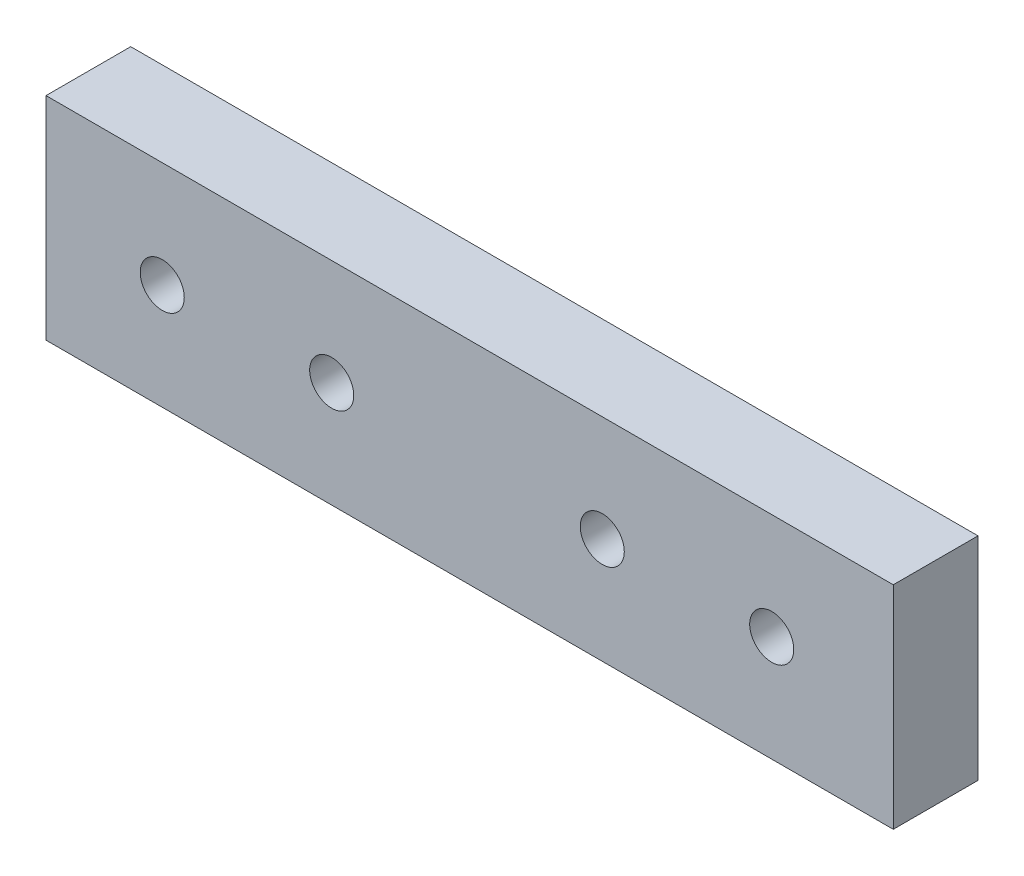
ISO-10303-21;
HEADER;
FILE_DESCRIPTION(('STEP AP214'),'2;1');
FILE_NAME('part.step','',(''),(''),'','','');
FILE_SCHEMA(('AUTOMOTIVE_DESIGN { 1 0 10303 214 1 1 1 1 }'));
ENDSEC;
DATA;
#1=APPLICATION_CONTEXT('core data for automotive mechanical design processes');
#2=APPLICATION_PROTOCOL_DEFINITION('international standard','automotive_design',2000,#1);
#3=PRODUCT_CONTEXT('',#1,'mechanical');
#4=PRODUCT('Part','Part','',(#3));
#5=PRODUCT_RELATED_PRODUCT_CATEGORY('part','',(#4));
#6=PRODUCT_DEFINITION_FORMATION('','',#4);
#7=PRODUCT_DEFINITION_CONTEXT('part definition',#1,'design');
#8=PRODUCT_DEFINITION('design','',#6,#7);
#9=PRODUCT_DEFINITION_SHAPE('','',#8);
#10=(LENGTH_UNIT() NAMED_UNIT(*) SI_UNIT(.MILLI.,.METRE.));
#11=(NAMED_UNIT(*) PLANE_ANGLE_UNIT() SI_UNIT($,.RADIAN.));
#12=(NAMED_UNIT(*) SI_UNIT($,.STERADIAN.) SOLID_ANGLE_UNIT());
#13=UNCERTAINTY_MEASURE_WITH_UNIT(LENGTH_MEASURE(1.E-05),#10,'distance_accuracy_value','');
#14=(GEOMETRIC_REPRESENTATION_CONTEXT(3) GLOBAL_UNCERTAINTY_ASSIGNED_CONTEXT((#13)) GLOBAL_UNIT_ASSIGNED_CONTEXT((#10,
#11,#12)) REPRESENTATION_CONTEXT('',''));
#15=CARTESIAN_POINT('',(0.,0.,0.));
#16=DIRECTION('',(0.,0.,1.));
#17=DIRECTION('',(1.,0.,0.));
#18=AXIS2_PLACEMENT_3D('',#15,#16,#17);
#19=CARTESIAN_POINT('',(-85.3473640143417,12.5,-75.));
#20=DIRECTION('',(0.,0.,1.));
#21=DIRECTION('',(1.,0.,0.));
#22=AXIS2_PLACEMENT_3D('',#19,#20,#21);
#23=CYLINDRICAL_SURFACE('',#22,2.6);
#24=CARTESIAN_POINT('',(-85.3473640143417,12.5,-17.5));
#25=DIRECTION('',(0.,0.,1.));
#26=DIRECTION('',(1.,0.,0.));
#27=AXIS2_PLACEMENT_3D('',#24,#25,#26);
#28=CIRCLE('',#27,2.6);
#29=CARTESIAN_POINT('',(-82.7473640143417,12.5,-17.5));
#30=VERTEX_POINT('',#29);
#31=EDGE_CURVE('E445',#30,#30,#28,.T.);
#32=ORIENTED_EDGE('',*,*,#31,.T.);
#33=EDGE_LOOP('',(#32));
#34=FACE_BOUND('',#33,.T.);
#35=CARTESIAN_POINT('',(-85.3473640143417,12.5,-24.5));
#36=DIRECTION('',(0.,0.,-1.));
#37=DIRECTION('',(-1.,0.,0.));
#38=AXIS2_PLACEMENT_3D('',#35,#36,#37);
#39=CIRCLE('',#38,2.6);
#40=CARTESIAN_POINT('',(-87.9473640143417,12.5,-24.5));
#41=VERTEX_POINT('',#40);
#42=EDGE_CURVE('E37',#41,#41,#39,.F.);
#43=ORIENTED_EDGE('',*,*,#42,.F.);
#44=EDGE_LOOP('',(#43));
#45=FACE_BOUND('',#44,.T.);
#46=ADVANCED_FACE('F33',(#34,#45),#23,.F.);
#47=CARTESIAN_POINT('',(-157.28059455583,12.5,-75.));
#48=DIRECTION('',(0.,0.,1.));
#49=DIRECTION('',(1.,0.,0.));
#50=AXIS2_PLACEMENT_3D('',#47,#48,#49);
#51=CYLINDRICAL_SURFACE('',#50,2.59999999999999);
#52=CARTESIAN_POINT('',(-157.28059455583,12.5,-17.5));
#53=DIRECTION('',(0.,0.,1.));
#54=DIRECTION('',(1.,0.,0.));
#55=AXIS2_PLACEMENT_3D('',#52,#53,#54);
#56=CIRCLE('',#55,2.59999999999999);
#57=CARTESIAN_POINT('',(-154.68059455583,12.5,-17.5));
#58=VERTEX_POINT('',#57);
#59=EDGE_CURVE('E448',#58,#58,#56,.T.);
#60=ORIENTED_EDGE('',*,*,#59,.T.);
#61=EDGE_LOOP('',(#60));
#62=FACE_BOUND('',#61,.T.);
#63=CARTESIAN_POINT('',(-157.28059455583,12.5,-24.5));
#64=DIRECTION('',(0.,0.,-1.));
#65=DIRECTION('',(-1.,0.,0.));
#66=AXIS2_PLACEMENT_3D('',#63,#64,#65);
#67=CIRCLE('',#66,2.59999999999999);
#68=CARTESIAN_POINT('',(-159.88059455583,12.5,-24.5));
#69=VERTEX_POINT('',#68);
#70=EDGE_CURVE('E460',#69,#69,#67,.F.);
#71=ORIENTED_EDGE('',*,*,#70,.F.);
#72=EDGE_LOOP('',(#71));
#73=FACE_BOUND('',#72,.T.);
#74=ADVANCED_FACE('F470',(#62,#73),#51,.F.);
#75=CARTESIAN_POINT('',(-105.347364014342,12.5,-75.));
#76=DIRECTION('',(0.,0.,1.));
#77=DIRECTION('',(1.,0.,0.));
#78=AXIS2_PLACEMENT_3D('',#75,#76,#77);
#79=CYLINDRICAL_SURFACE('',#78,2.6);
#80=CARTESIAN_POINT('',(-105.347364014342,12.5,-17.5));
#81=DIRECTION('',(0.,0.,1.));
#82=DIRECTION('',(1.,0.,0.));
#83=AXIS2_PLACEMENT_3D('',#80,#81,#82);
#84=CIRCLE('',#83,2.6);
#85=CARTESIAN_POINT('',(-102.747364014342,12.5,-17.5));
#86=VERTEX_POINT('',#85);
#87=EDGE_CURVE('E451',#86,#86,#84,.T.);
#88=ORIENTED_EDGE('',*,*,#87,.T.);
#89=EDGE_LOOP('',(#88));
#90=FACE_BOUND('',#89,.T.);
#91=CARTESIAN_POINT('',(-105.347364014342,12.5,-24.5));
#92=DIRECTION('',(0.,0.,-1.));
#93=DIRECTION('',(-1.,0.,0.));
#94=AXIS2_PLACEMENT_3D('',#91,#92,#93);
#95=CIRCLE('',#94,2.6);
#96=CARTESIAN_POINT('',(-107.947364014342,12.5,-24.5));
#97=VERTEX_POINT('',#96);
#98=EDGE_CURVE('E458',#97,#97,#95,.F.);
#99=ORIENTED_EDGE('',*,*,#98,.F.);
#100=EDGE_LOOP('',(#99));
#101=FACE_BOUND('',#100,.T.);
#102=ADVANCED_FACE('F476',(#90,#101),#79,.F.);
#103=CARTESIAN_POINT('',(-137.28059455583,12.5,-75.));
#104=DIRECTION('',(0.,0.,1.));
#105=DIRECTION('',(1.,0.,0.));
#106=AXIS2_PLACEMENT_3D('',#103,#104,#105);
#107=CYLINDRICAL_SURFACE('',#106,2.59999999999999);
#108=CARTESIAN_POINT('',(-137.28059455583,12.5,-17.5));
#109=DIRECTION('',(0.,0.,1.));
#110=DIRECTION('',(1.,0.,0.));
#111=AXIS2_PLACEMENT_3D('',#108,#109,#110);
#112=CIRCLE('',#111,2.59999999999999);
#113=CARTESIAN_POINT('',(-134.68059455583,12.5,-17.5));
#114=VERTEX_POINT('',#113);
#115=EDGE_CURVE('E433',#114,#114,#112,.T.);
#116=ORIENTED_EDGE('',*,*,#115,.T.);
#117=EDGE_LOOP('',(#116));
#118=FACE_BOUND('',#117,.T.);
#119=CARTESIAN_POINT('',(-137.28059455583,12.5,-24.5));
#120=DIRECTION('',(0.,0.,-1.));
#121=DIRECTION('',(-1.,0.,0.));
#122=AXIS2_PLACEMENT_3D('',#119,#120,#121);
#123=CIRCLE('',#122,2.59999999999999);
#124=CARTESIAN_POINT('',(-139.88059455583,12.5,-24.5));
#125=VERTEX_POINT('',#124);
#126=EDGE_CURVE('E269',#125,#125,#123,.F.);
#127=ORIENTED_EDGE('',*,*,#126,.F.);
#128=EDGE_LOOP('',(#127));
#129=FACE_BOUND('',#128,.T.);
#130=ADVANCED_FACE('F502',(#118,#129),#107,.F.);
#131=CARTESIAN_POINT('',(-171.,0.,-27.5));
#132=DIRECTION('',(1.,0.,0.));
#133=DIRECTION('',(0.,0.,-1.));
#134=AXIS2_PLACEMENT_3D('',#131,#132,#133);
#135=PLANE('',#134);
#136=DIRECTION('',(0.,1.,0.));
#137=VECTOR('',#136,1.);
#138=CARTESIAN_POINT('',(-171.,0.,-17.5));
#139=LINE('',#138,#137);
#140=CARTESIAN_POINT('',(-171.,0.,-17.5));
#141=VERTEX_POINT('',#140);
#142=CARTESIAN_POINT('',(-171.,25.,-17.5));
#143=VERTEX_POINT('',#142);
#144=EDGE_CURVE('E429',#141,#143,#139,.T.);
#145=ORIENTED_EDGE('',*,*,#144,.T.);
#146=DIRECTION('',(0.,0.,1.));
#147=VECTOR('',#146,1.);
#148=CARTESIAN_POINT('',(-171.,25.,-27.5));
#149=LINE('',#148,#147);
#150=CARTESIAN_POINT('',(-171.,25.,-27.5));
#151=VERTEX_POINT('',#150);
#152=EDGE_CURVE('E11',#151,#143,#149,.T.);
#153=ORIENTED_EDGE('',*,*,#152,.F.);
#154=DIRECTION('',(0.,1.,0.));
#155=VECTOR('',#154,1.);
#156=CARTESIAN_POINT('',(-171.,0.,-27.5));
#157=LINE('',#156,#155);
#158=CARTESIAN_POINT('',(-171.,0.,-27.5));
#159=VERTEX_POINT('',#158);
#160=EDGE_CURVE('E418',#159,#151,#157,.T.);
#161=ORIENTED_EDGE('',*,*,#160,.F.);
#162=DIRECTION('',(0.,0.,1.));
#163=VECTOR('',#162,1.);
#164=CARTESIAN_POINT('',(-171.,0.,-27.5));
#165=LINE('',#164,#163);
#166=EDGE_CURVE('E428',#159,#141,#165,.T.);
#167=ORIENTED_EDGE('',*,*,#166,.T.);
#168=EDGE_LOOP('',(#145,#153,#161,#167));
#169=FACE_BOUND('',#168,.T.);
#170=ADVANCED_FACE('F35',(#169),#135,.F.);
#171=CARTESIAN_POINT('',(-71.,25.,-27.5));
#172=DIRECTION('',(0.,-1.,0.));
#173=DIRECTION('',(0.,0.,-1.));
#174=AXIS2_PLACEMENT_3D('',#171,#172,#173);
#175=PLANE('',#174);
#176=DIRECTION('',(1.,0.,0.));
#177=VECTOR('',#176,1.);
#178=CARTESIAN_POINT('',(-71.,25.,-17.5));
#179=LINE('',#178,#177);
#180=CARTESIAN_POINT('',(-71.,25.,-17.5));
#181=VERTEX_POINT('',#180);
#182=EDGE_CURVE('E432',#143,#181,#179,.T.);
#183=ORIENTED_EDGE('',*,*,#182,.T.);
#184=DIRECTION('',(0.,0.,1.));
#185=VECTOR('',#184,1.);
#186=CARTESIAN_POINT('',(-71.,25.,-27.5));
#187=LINE('',#186,#185);
#188=CARTESIAN_POINT('',(-71.,25.,-27.5));
#189=VERTEX_POINT('',#188);
#190=EDGE_CURVE('E42',#189,#181,#187,.T.);
#191=ORIENTED_EDGE('',*,*,#190,.F.);
#192=DIRECTION('',(1.,0.,0.));
#193=VECTOR('',#192,1.);
#194=CARTESIAN_POINT('',(-71.,25.,-27.5));
#195=LINE('',#194,#193);
#196=EDGE_CURVE('E421',#151,#189,#195,.T.);
#197=ORIENTED_EDGE('',*,*,#196,.F.);
#198=ORIENTED_EDGE('',*,*,#152,.T.);
#199=EDGE_LOOP('',(#183,#191,#197,#198));
#200=FACE_BOUND('',#199,.T.);
#201=ADVANCED_FACE('F495',(#200),#175,.F.);
#202=CARTESIAN_POINT('',(-71.,0.,-27.5));
#203=DIRECTION('',(-1.,0.,0.));
#204=DIRECTION('',(0.,0.,1.));
#205=AXIS2_PLACEMENT_3D('',#202,#203,#204);
#206=PLANE('',#205);
#207=DIRECTION('',(0.,-1.,0.));
#208=VECTOR('',#207,1.);
#209=CARTESIAN_POINT('',(-71.,0.,-17.5));
#210=LINE('',#209,#208);
#211=CARTESIAN_POINT('',(-71.,0.,-17.5));
#212=VERTEX_POINT('',#211);
#213=EDGE_CURVE('E435',#181,#212,#210,.T.);
#214=ORIENTED_EDGE('',*,*,#213,.T.);
#215=DIRECTION('',(0.,0.,1.));
#216=VECTOR('',#215,1.);
#217=CARTESIAN_POINT('',(-71.,0.,-27.5));
#218=LINE('',#217,#216);
#219=CARTESIAN_POINT('',(-71.,0.,-27.5));
#220=VERTEX_POINT('',#219);
#221=EDGE_CURVE('E440',#220,#212,#218,.T.);
#222=ORIENTED_EDGE('',*,*,#221,.F.);
#223=DIRECTION('',(0.,-1.,0.));
#224=VECTOR('',#223,1.);
#225=CARTESIAN_POINT('',(-71.,0.,-27.5));
#226=LINE('',#225,#224);
#227=EDGE_CURVE('E424',#189,#220,#226,.T.);
#228=ORIENTED_EDGE('',*,*,#227,.F.);
#229=ORIENTED_EDGE('',*,*,#190,.T.);
#230=EDGE_LOOP('',(#214,#222,#228,#229));
#231=FACE_BOUND('',#230,.T.);
#232=ADVANCED_FACE('F492',(#231),#206,.F.);
#233=CARTESIAN_POINT('',(-71.,0.,-27.5));
#234=DIRECTION('',(0.,1.,0.));
#235=DIRECTION('',(-1.,0.,0.));
#236=AXIS2_PLACEMENT_3D('',#233,#234,#235);
#237=PLANE('',#236);
#238=DIRECTION('',(-1.,0.,0.));
#239=VECTOR('',#238,1.);
#240=CARTESIAN_POINT('',(-71.,0.,-17.5));
#241=LINE('',#240,#239);
#242=EDGE_CURVE('E422',#212,#141,#241,.T.);
#243=ORIENTED_EDGE('',*,*,#242,.T.);
#244=ORIENTED_EDGE('',*,*,#166,.F.);
#245=DIRECTION('',(-1.,0.,0.));
#246=VECTOR('',#245,1.);
#247=CARTESIAN_POINT('',(-71.,0.,-27.5));
#248=LINE('',#247,#246);
#249=EDGE_CURVE('E426',#220,#159,#248,.T.);
#250=ORIENTED_EDGE('',*,*,#249,.F.);
#251=ORIENTED_EDGE('',*,*,#221,.T.);
#252=EDGE_LOOP('',(#243,#244,#250,#251));
#253=FACE_BOUND('',#252,.T.);
#254=ADVANCED_FACE('F485',(#253),#237,.F.);
#255=CARTESIAN_POINT('',(0.,0.,-27.5));
#256=DIRECTION('',(0.,0.,1.));
#257=DIRECTION('',(1.,0.,0.));
#258=AXIS2_PLACEMENT_3D('',#255,#256,#257);
#259=PLANE('',#258);
#260=DIRECTION('',(-0.499999999999999,0.866025403784439,0.));
#261=VECTOR('',#260,1.);
#262=CARTESIAN_POINT('',(-139.647730659508,8.4,-27.5));
#263=LINE('',#262,#261);
#264=CARTESIAN_POINT('',(-139.647730659508,8.39999999999999,-27.5));
#265=VERTEX_POINT('',#264);
#266=CARTESIAN_POINT('',(-142.014866763185,12.5,-27.5));
#267=VERTEX_POINT('',#266);
#268=EDGE_CURVE('E256',#265,#267,#263,.T.);
#269=ORIENTED_EDGE('',*,*,#268,.F.);
#270=DIRECTION('',(-1.,0.,0.));
#271=VECTOR('',#270,1.);
#272=CARTESIAN_POINT('',(-134.913458452153,8.4,-27.5));
#273=LINE('',#272,#271);
#274=CARTESIAN_POINT('',(-134.913458452153,8.4,-27.5));
#275=VERTEX_POINT('',#274);
#276=EDGE_CURVE('E50',#275,#265,#273,.T.);
#277=ORIENTED_EDGE('',*,*,#276,.F.);
#278=DIRECTION('',(-0.5,-0.866025403784438,0.));
#279=VECTOR('',#278,1.);
#280=CARTESIAN_POINT('',(-132.546322348475,12.5,-27.5));
#281=LINE('',#280,#279);
#282=CARTESIAN_POINT('',(-132.546322348475,12.5,-27.5));
#283=VERTEX_POINT('',#282);
#284=EDGE_CURVE('E242',#283,#275,#281,.T.);
#285=ORIENTED_EDGE('',*,*,#284,.F.);
#286=DIRECTION('',(0.499999999999994,-0.866025403784442,0.));
#287=VECTOR('',#286,1.);
#288=CARTESIAN_POINT('',(-134.913458452153,16.6,-27.5));
#289=LINE('',#288,#287);
#290=CARTESIAN_POINT('',(-134.913458452153,16.6,-27.5));
#291=VERTEX_POINT('',#290);
#292=EDGE_CURVE('E245',#291,#283,#289,.T.);
#293=ORIENTED_EDGE('',*,*,#292,.F.);
#294=DIRECTION('',(1.,0.,0.));
#295=VECTOR('',#294,1.);
#296=CARTESIAN_POINT('',(-139.647730659508,16.6,-27.5));
#297=LINE('',#296,#295);
#298=CARTESIAN_POINT('',(-139.647730659508,16.6,-27.5));
#299=VERTEX_POINT('',#298);
#300=EDGE_CURVE('E262',#299,#291,#297,.T.);
#301=ORIENTED_EDGE('',*,*,#300,.F.);
#302=DIRECTION('',(0.5,0.866025403784439,0.));
#303=VECTOR('',#302,1.);
#304=CARTESIAN_POINT('',(-142.014866763185,12.5,-27.5));
#305=LINE('',#304,#303);
#306=EDGE_CURVE('E259',#267,#299,#305,.T.);
#307=ORIENTED_EDGE('',*,*,#306,.F.);
#308=EDGE_LOOP('',(#269,#277,#285,#293,#301,#307));
#309=FACE_BOUND('',#308,.T.);
#310=DIRECTION('',(-0.499999999999999,0.866025403784439,0.));
#311=VECTOR('',#310,1.);
#312=CARTESIAN_POINT('',(-107.714500118019,8.40000000000002,-27.5));
#313=LINE('',#312,#311);
#314=CARTESIAN_POINT('',(-107.714500118019,8.40000000000003,-27.5));
#315=VERTEX_POINT('',#314);
#316=CARTESIAN_POINT('',(-110.081636221697,12.5,-27.5));
#317=VERTEX_POINT('',#316);
#318=EDGE_CURVE('E298',#315,#317,#313,.T.);
#319=ORIENTED_EDGE('',*,*,#318,.F.);
#320=DIRECTION('',(-1.,0.,0.));
#321=VECTOR('',#320,1.);
#322=CARTESIAN_POINT('',(-102.980227910664,8.40000000000002,-27.5));
#323=LINE('',#322,#321);
#324=CARTESIAN_POINT('',(-102.980227910664,8.40000000000002,-27.5));
#325=VERTEX_POINT('',#324);
#326=EDGE_CURVE('E58',#325,#315,#323,.T.);
#327=ORIENTED_EDGE('',*,*,#326,.F.);
#328=DIRECTION('',(-0.499999999999999,-0.866025403784439,0.));
#329=VECTOR('',#328,1.);
#330=CARTESIAN_POINT('',(-100.613091806987,12.5,-27.5));
#331=LINE('',#330,#329);
#332=CARTESIAN_POINT('',(-100.613091806987,12.5,-27.5));
#333=VERTEX_POINT('',#332);
#334=EDGE_CURVE('E281',#333,#325,#331,.T.);
#335=ORIENTED_EDGE('',*,*,#334,.F.);
#336=DIRECTION('',(0.5,-0.866025403784439,0.));
#337=VECTOR('',#336,1.);
#338=CARTESIAN_POINT('',(-102.980227910664,16.6,-27.5));
#339=LINE('',#338,#337);
#340=CARTESIAN_POINT('',(-102.980227910664,16.6,-27.5));
#341=VERTEX_POINT('',#340);
#342=EDGE_CURVE('E308',#341,#333,#339,.T.);
#343=ORIENTED_EDGE('',*,*,#342,.F.);
#344=DIRECTION('',(1.,0.,0.));
#345=VECTOR('',#344,1.);
#346=CARTESIAN_POINT('',(-107.714500118019,16.6,-27.5));
#347=LINE('',#346,#345);
#348=CARTESIAN_POINT('',(-107.714500118019,16.6,-27.5));
#349=VERTEX_POINT('',#348);
#350=EDGE_CURVE('E305',#349,#341,#347,.T.);
#351=ORIENTED_EDGE('',*,*,#350,.F.);
#352=DIRECTION('',(0.499999999999998,0.86602540378444,0.));
#353=VECTOR('',#352,1.);
#354=CARTESIAN_POINT('',(-110.081636221697,12.5,-27.5));
#355=LINE('',#354,#353);
#356=EDGE_CURVE('E302',#317,#349,#355,.T.);
#357=ORIENTED_EDGE('',*,*,#356,.F.);
#358=EDGE_LOOP('',(#319,#327,#335,#343,#351,#357));
#359=FACE_BOUND('',#358,.T.);
#360=DIRECTION('',(-0.5,0.866025403784439,0.));
#361=VECTOR('',#360,1.);
#362=CARTESIAN_POINT('',(-159.759099757909,8.20710306317599,-27.5));
#363=LINE('',#362,#361);
#364=CARTESIAN_POINT('',(-159.759099757909,8.20710306317597,-27.5));
#365=VERTEX_POINT('',#364);
#366=CARTESIAN_POINT('',(-162.237604959988,12.5,-27.5));
#367=VERTEX_POINT('',#366);
#368=EDGE_CURVE('E345',#365,#367,#363,.T.);
#369=ORIENTED_EDGE('',*,*,#368,.F.);
#370=DIRECTION('',(-1.,0.,0.));
#371=VECTOR('',#370,1.);
#372=CARTESIAN_POINT('',(-154.802089353752,8.20710306317599,-27.5));
#373=LINE('',#372,#371);
#374=CARTESIAN_POINT('',(-154.802089353752,8.20710306317599,-27.5));
#375=VERTEX_POINT('',#374);
#376=EDGE_CURVE('E343',#375,#365,#373,.T.);
#377=ORIENTED_EDGE('',*,*,#376,.F.);
#378=DIRECTION('',(-0.499999999999997,-0.86602540378444,0.));
#379=VECTOR('',#378,1.);
#380=CARTESIAN_POINT('',(-152.323584151673,12.5,-27.5));
#381=LINE('',#380,#379);
#382=CARTESIAN_POINT('',(-152.323584151673,12.5,-27.5));
#383=VERTEX_POINT('',#382);
#384=EDGE_CURVE('E327',#383,#375,#381,.T.);
#385=ORIENTED_EDGE('',*,*,#384,.F.);
#386=DIRECTION('',(0.5,-0.866025403784439,0.));
#387=VECTOR('',#386,1.);
#388=CARTESIAN_POINT('',(-154.802089353752,16.792896936824,-27.5));
#389=LINE('',#388,#387);
#390=CARTESIAN_POINT('',(-154.802089353752,16.792896936824,-27.5));
#391=VERTEX_POINT('',#390);
#392=EDGE_CURVE('E355',#391,#383,#389,.T.);
#393=ORIENTED_EDGE('',*,*,#392,.F.);
#394=DIRECTION('',(1.,0.,0.));
#395=VECTOR('',#394,1.);
#396=CARTESIAN_POINT('',(-159.759099757909,16.792896936824,-27.5));
#397=LINE('',#396,#395);
#398=CARTESIAN_POINT('',(-159.759099757909,16.792896936824,-27.5));
#399=VERTEX_POINT('',#398);
#400=EDGE_CURVE('E352',#399,#391,#397,.T.);
#401=ORIENTED_EDGE('',*,*,#400,.F.);
#402=DIRECTION('',(0.500000000000001,0.866025403784438,0.));
#403=VECTOR('',#402,1.);
#404=CARTESIAN_POINT('',(-162.237604959988,12.5,-27.5));
#405=LINE('',#404,#403);
#406=EDGE_CURVE('E349',#367,#399,#405,.T.);
#407=ORIENTED_EDGE('',*,*,#406,.F.);
#408=EDGE_LOOP('',(#369,#377,#385,#393,#401,#407));
#409=FACE_BOUND('',#408,.T.);
#410=DIRECTION('',(-0.500000000000003,0.866025403784437,0.));
#411=VECTOR('',#410,1.);
#412=CARTESIAN_POINT('',(-87.7145001180192,8.39999999999996,-27.5));
#413=LINE('',#412,#411);
#414=CARTESIAN_POINT('',(-87.7145001180192,8.39999999999996,-27.5));
#415=VERTEX_POINT('',#414);
#416=CARTESIAN_POINT('',(-90.0816362216967,12.5,-27.5));
#417=VERTEX_POINT('',#416);
#418=EDGE_CURVE('E393',#415,#417,#413,.T.);
#419=ORIENTED_EDGE('',*,*,#418,.F.);
#420=DIRECTION('',(-1.,0.,0.));
#421=VECTOR('',#420,1.);
#422=CARTESIAN_POINT('',(-82.9802279106642,8.39999999999996,-27.5));
#423=LINE('',#422,#421);
#424=CARTESIAN_POINT('',(-82.9802279106642,8.39999999999996,-27.5));
#425=VERTEX_POINT('',#424);
#426=EDGE_CURVE('E391',#425,#415,#423,.T.);
#427=ORIENTED_EDGE('',*,*,#426,.F.);
#428=DIRECTION('',(-0.499999999999999,-0.866025403784439,0.));
#429=VECTOR('',#428,1.);
#430=CARTESIAN_POINT('',(-80.6130918069868,12.5,-27.5));
#431=LINE('',#430,#429);
#432=CARTESIAN_POINT('',(-80.6130918069868,12.5,-27.5));
#433=VERTEX_POINT('',#432);
#434=EDGE_CURVE('E375',#433,#425,#431,.T.);
#435=ORIENTED_EDGE('',*,*,#434,.F.);
#436=DIRECTION('',(0.5,-0.866025403784439,0.));
#437=VECTOR('',#436,1.);
#438=CARTESIAN_POINT('',(-82.9802279106642,16.6,-27.5));
#439=LINE('',#438,#437);
#440=CARTESIAN_POINT('',(-82.9802279106642,16.6,-27.5));
#441=VERTEX_POINT('',#440);
#442=EDGE_CURVE('E402',#441,#433,#439,.T.);
#443=ORIENTED_EDGE('',*,*,#442,.F.);
#444=DIRECTION('',(1.,0.,0.));
#445=VECTOR('',#444,1.);
#446=CARTESIAN_POINT('',(-87.7145001180192,16.6,-27.5));
#447=LINE('',#446,#445);
#448=CARTESIAN_POINT('',(-87.7145001180192,16.6,-27.5));
#449=VERTEX_POINT('',#448);
#450=EDGE_CURVE('E399',#449,#441,#447,.T.);
#451=ORIENTED_EDGE('',*,*,#450,.F.);
#452=DIRECTION('',(0.500000000000001,0.866025403784438,0.));
#453=VECTOR('',#452,1.);
#454=CARTESIAN_POINT('',(-90.0816362216967,12.5,-27.5));
#455=LINE('',#454,#453);
#456=EDGE_CURVE('E396',#417,#449,#455,.T.);
#457=ORIENTED_EDGE('',*,*,#456,.F.);
#458=EDGE_LOOP('',(#419,#427,#435,#443,#451,#457));
#459=FACE_BOUND('',#458,.T.);
#460=ORIENTED_EDGE('',*,*,#160,.T.);
#461=ORIENTED_EDGE('',*,*,#196,.T.);
#462=ORIENTED_EDGE('',*,*,#227,.T.);
#463=ORIENTED_EDGE('',*,*,#249,.T.);
#464=EDGE_LOOP('',(#460,#461,#462,#463));
#465=FACE_BOUND('',#464,.T.);
#466=ADVANCED_FACE('F481',(#309,#359,#409,#459,#465),#259,.F.);
#467=CARTESIAN_POINT('',(0.,0.,-17.5));
#468=DIRECTION('',(0.,0.,1.));
#469=DIRECTION('',(1.,0.,0.));
#470=AXIS2_PLACEMENT_3D('',#467,#468,#469);
#471=PLANE('',#470);
#472=ORIENTED_EDGE('',*,*,#115,.F.);
#473=EDGE_LOOP('',(#472));
#474=FACE_BOUND('',#473,.T.);
#475=ORIENTED_EDGE('',*,*,#87,.F.);
#476=EDGE_LOOP('',(#475));
#477=FACE_BOUND('',#476,.T.);
#478=ORIENTED_EDGE('',*,*,#59,.F.);
#479=EDGE_LOOP('',(#478));
#480=FACE_BOUND('',#479,.T.);
#481=ORIENTED_EDGE('',*,*,#31,.F.);
#482=EDGE_LOOP('',(#481));
#483=FACE_BOUND('',#482,.T.);
#484=ORIENTED_EDGE('',*,*,#144,.F.);
#485=ORIENTED_EDGE('',*,*,#242,.F.);
#486=ORIENTED_EDGE('',*,*,#213,.F.);
#487=ORIENTED_EDGE('',*,*,#182,.F.);
#488=EDGE_LOOP('',(#484,#485,#486,#487));
#489=FACE_BOUND('',#488,.T.);
#490=ADVANCED_FACE('F484',(#474,#477,#480,#483,#489),#471,.T.);
#491=CARTESIAN_POINT('',(0.,0.,-24.5000000000001));
#492=DIRECTION('',(0.,0.,-1.));
#493=DIRECTION('',(-1.,0.,0.));
#494=AXIS2_PLACEMENT_3D('',#491,#492,#493);
#495=PLANE('',#494);
#496=DIRECTION('',(-1.,0.,0.));
#497=VECTOR('',#496,1.);
#498=CARTESIAN_POINT('',(-134.913458452153,8.4,-24.5));
#499=LINE('',#498,#497);
#500=CARTESIAN_POINT('',(-134.913458452153,8.4,-24.5));
#501=VERTEX_POINT('',#500);
#502=CARTESIAN_POINT('',(-139.647730659508,8.4,-24.5));
#503=VERTEX_POINT('',#502);
#504=EDGE_CURVE('E222',#501,#503,#499,.T.);
#505=ORIENTED_EDGE('',*,*,#504,.T.);
#506=DIRECTION('',(-0.499999999999999,0.866025403784439,0.));
#507=VECTOR('',#506,1.);
#508=CARTESIAN_POINT('',(-139.647730659508,8.4,-24.5));
#509=LINE('',#508,#507);
#510=CARTESIAN_POINT('',(-142.014866763185,12.5,-24.5));
#511=VERTEX_POINT('',#510);
#512=EDGE_CURVE('E231',#503,#511,#509,.T.);
#513=ORIENTED_EDGE('',*,*,#512,.T.);
#514=DIRECTION('',(0.5,0.866025403784439,0.));
#515=VECTOR('',#514,1.);
#516=CARTESIAN_POINT('',(-142.014866763185,12.5,-24.5));
#517=LINE('',#516,#515);
#518=CARTESIAN_POINT('',(-139.647730659508,16.6,-24.5));
#519=VERTEX_POINT('',#518);
#520=EDGE_CURVE('E236',#511,#519,#517,.T.);
#521=ORIENTED_EDGE('',*,*,#520,.T.);
#522=DIRECTION('',(1.,0.,0.));
#523=VECTOR('',#522,1.);
#524=CARTESIAN_POINT('',(-139.647730659508,16.6,-24.5));
#525=LINE('',#524,#523);
#526=CARTESIAN_POINT('',(-134.913458452153,16.6,-24.5));
#527=VERTEX_POINT('',#526);
#528=EDGE_CURVE('E249',#519,#527,#525,.T.);
#529=ORIENTED_EDGE('',*,*,#528,.T.);
#530=DIRECTION('',(0.499999999999994,-0.866025403784442,0.));
#531=VECTOR('',#530,1.);
#532=CARTESIAN_POINT('',(-134.913458452153,16.6,-24.5));
#533=LINE('',#532,#531);
#534=CARTESIAN_POINT('',(-132.546322348475,12.5,-24.5));
#535=VERTEX_POINT('',#534);
#536=EDGE_CURVE('E252',#527,#535,#533,.T.);
#537=ORIENTED_EDGE('',*,*,#536,.T.);
#538=DIRECTION('',(-0.5,-0.866025403784438,0.));
#539=VECTOR('',#538,1.);
#540=CARTESIAN_POINT('',(-132.546322348475,12.5,-24.5));
#541=LINE('',#540,#539);
#542=EDGE_CURVE('E228',#535,#501,#541,.T.);
#543=ORIENTED_EDGE('',*,*,#542,.T.);
#544=EDGE_LOOP('',(#505,#513,#521,#529,#537,#543));
#545=FACE_BOUND('',#544,.T.);
#546=ORIENTED_EDGE('',*,*,#126,.T.);
#547=EDGE_LOOP('',(#546));
#548=FACE_BOUND('',#547,.T.);
#549=ADVANCED_FACE('F238',(#545,#548),#495,.T.);
#550=CARTESIAN_POINT('',(-134.913458452153,8.4,-24.5));
#551=DIRECTION('',(0.,-1.,0.));
#552=DIRECTION('',(1.,0.,0.));
#553=AXIS2_PLACEMENT_3D('',#550,#551,#552);
#554=PLANE('',#553);
#555=ORIENTED_EDGE('',*,*,#276,.T.);
#556=DIRECTION('',(0.,0.,-1.));
#557=VECTOR('',#556,1.);
#558=CARTESIAN_POINT('',(-139.647730659508,8.4,-24.5));
#559=LINE('',#558,#557);
#560=EDGE_CURVE('E218',#503,#265,#559,.T.);
#561=ORIENTED_EDGE('',*,*,#560,.F.);
#562=ORIENTED_EDGE('',*,*,#504,.F.);
#563=DIRECTION('',(0.,0.,-1.));
#564=VECTOR('',#563,1.);
#565=CARTESIAN_POINT('',(-134.913458452153,8.4,-24.5));
#566=LINE('',#565,#564);
#567=EDGE_CURVE('E267',#501,#275,#566,.T.);
#568=ORIENTED_EDGE('',*,*,#567,.T.);
#569=EDGE_LOOP('',(#555,#561,#562,#568));
#570=FACE_BOUND('',#569,.T.);
#571=ADVANCED_FACE('F220',(#570),#554,.F.);
#572=CARTESIAN_POINT('',(-132.546322348475,12.5,-24.5));
#573=DIRECTION('',(0.866025403784438,-0.5,0.));
#574=DIRECTION('',(0.5,0.866025403784439,0.));
#575=AXIS2_PLACEMENT_3D('',#572,#573,#574);
#576=PLANE('',#575);
#577=ORIENTED_EDGE('',*,*,#284,.T.);
#578=ORIENTED_EDGE('',*,*,#567,.F.);
#579=ORIENTED_EDGE('',*,*,#542,.F.);
#580=DIRECTION('',(0.,0.,-1.));
#581=VECTOR('',#580,1.);
#582=CARTESIAN_POINT('',(-132.546322348475,12.5,-24.5));
#583=LINE('',#582,#581);
#584=EDGE_CURVE('E270',#535,#283,#583,.T.);
#585=ORIENTED_EDGE('',*,*,#584,.T.);
#586=EDGE_LOOP('',(#577,#578,#579,#585));
#587=FACE_BOUND('',#586,.T.);
#588=ADVANCED_FACE('F611',(#587),#576,.F.);
#589=CARTESIAN_POINT('',(-134.913458452153,16.6,-24.5));
#590=DIRECTION('',(0.866025403784442,0.499999999999994,0.));
#591=DIRECTION('',(-0.499999999999994,0.866025403784442,0.));
#592=AXIS2_PLACEMENT_3D('',#589,#590,#591);
#593=PLANE('',#592);
#594=ORIENTED_EDGE('',*,*,#292,.T.);
#595=ORIENTED_EDGE('',*,*,#584,.F.);
#596=ORIENTED_EDGE('',*,*,#536,.F.);
#597=DIRECTION('',(0.,0.,-1.));
#598=VECTOR('',#597,1.);
#599=CARTESIAN_POINT('',(-134.913458452153,16.6,-24.5));
#600=LINE('',#599,#598);
#601=EDGE_CURVE('E272',#527,#291,#600,.T.);
#602=ORIENTED_EDGE('',*,*,#601,.T.);
#603=EDGE_LOOP('',(#594,#595,#596,#602));
#604=FACE_BOUND('',#603,.T.);
#605=ADVANCED_FACE('F621',(#604),#593,.F.);
#606=CARTESIAN_POINT('',(-139.647730659508,16.6,-24.5));
#607=DIRECTION('',(0.,1.,0.));
#608=DIRECTION('',(0.,0.,1.));
#609=AXIS2_PLACEMENT_3D('',#606,#607,#608);
#610=PLANE('',#609);
#611=ORIENTED_EDGE('',*,*,#300,.T.);
#612=ORIENTED_EDGE('',*,*,#601,.F.);
#613=ORIENTED_EDGE('',*,*,#528,.F.);
#614=DIRECTION('',(0.,0.,-1.));
#615=VECTOR('',#614,1.);
#616=CARTESIAN_POINT('',(-139.647730659508,16.6,-24.5));
#617=LINE('',#616,#615);
#618=EDGE_CURVE('E274',#519,#299,#617,.T.);
#619=ORIENTED_EDGE('',*,*,#618,.T.);
#620=EDGE_LOOP('',(#611,#612,#613,#619));
#621=FACE_BOUND('',#620,.T.);
#622=ADVANCED_FACE('F617',(#621),#610,.F.);
#623=CARTESIAN_POINT('',(-142.014866763185,12.5,-24.5));
#624=DIRECTION('',(-0.866025403784439,0.5,0.));
#625=DIRECTION('',(-0.5,-0.866025403784439,0.));
#626=AXIS2_PLACEMENT_3D('',#623,#624,#625);
#627=PLANE('',#626);
#628=ORIENTED_EDGE('',*,*,#306,.T.);
#629=ORIENTED_EDGE('',*,*,#618,.F.);
#630=ORIENTED_EDGE('',*,*,#520,.F.);
#631=DIRECTION('',(0.,0.,-1.));
#632=VECTOR('',#631,1.);
#633=CARTESIAN_POINT('',(-142.014866763185,12.5,-24.5));
#634=LINE('',#633,#632);
#635=EDGE_CURVE('E227',#511,#267,#634,.T.);
#636=ORIENTED_EDGE('',*,*,#635,.T.);
#637=EDGE_LOOP('',(#628,#629,#630,#636));
#638=FACE_BOUND('',#637,.T.);
#639=ADVANCED_FACE('F614',(#638),#627,.F.);
#640=CARTESIAN_POINT('',(-139.647730659508,8.4,-24.5));
#641=DIRECTION('',(-0.866025403784439,-0.499999999999999,0.));
#642=DIRECTION('',(0.499999999999999,-0.866025403784439,0.));
#643=AXIS2_PLACEMENT_3D('',#640,#641,#642);
#644=PLANE('',#643);
#645=ORIENTED_EDGE('',*,*,#268,.T.);
#646=ORIENTED_EDGE('',*,*,#635,.F.);
#647=ORIENTED_EDGE('',*,*,#512,.F.);
#648=ORIENTED_EDGE('',*,*,#560,.T.);
#649=EDGE_LOOP('',(#645,#646,#647,#648));
#650=FACE_BOUND('',#649,.T.);
#651=ADVANCED_FACE('F232',(#650),#644,.F.);
#652=CARTESIAN_POINT('',(0.,0.,-24.5000000000001));
#653=DIRECTION('',(0.,0.,-1.));
#654=DIRECTION('',(-1.,0.,0.));
#655=AXIS2_PLACEMENT_3D('',#652,#653,#654);
#656=PLANE('',#655);
#657=DIRECTION('',(-1.,0.,0.));
#658=VECTOR('',#657,1.);
#659=CARTESIAN_POINT('',(-102.980227910664,8.40000000000002,-24.5));
#660=LINE('',#659,#658);
#661=CARTESIAN_POINT('',(-102.980227910664,8.40000000000002,-24.5));
#662=VERTEX_POINT('',#661);
#663=CARTESIAN_POINT('',(-107.714500118019,8.40000000000002,-24.5));
#664=VERTEX_POINT('',#663);
#665=EDGE_CURVE('E277',#662,#664,#660,.T.);
#666=ORIENTED_EDGE('',*,*,#665,.T.);
#667=DIRECTION('',(-0.499999999999999,0.866025403784439,0.));
#668=VECTOR('',#667,1.);
#669=CARTESIAN_POINT('',(-107.714500118019,8.40000000000002,-24.5));
#670=LINE('',#669,#668);
#671=CARTESIAN_POINT('',(-110.081636221697,12.5,-24.5));
#672=VERTEX_POINT('',#671);
#673=EDGE_CURVE('E280',#664,#672,#670,.T.);
#674=ORIENTED_EDGE('',*,*,#673,.T.);
#675=DIRECTION('',(0.499999999999998,0.86602540378444,0.));
#676=VECTOR('',#675,1.);
#677=CARTESIAN_POINT('',(-110.081636221697,12.5,-24.5));
#678=LINE('',#677,#676);
#679=CARTESIAN_POINT('',(-107.714500118019,16.6,-24.5));
#680=VERTEX_POINT('',#679);
#681=EDGE_CURVE('E284',#672,#680,#678,.T.);
#682=ORIENTED_EDGE('',*,*,#681,.T.);
#683=DIRECTION('',(1.,0.,0.));
#684=VECTOR('',#683,1.);
#685=CARTESIAN_POINT('',(-107.714500118019,16.6,-24.5));
#686=LINE('',#685,#684);
#687=CARTESIAN_POINT('',(-102.980227910664,16.6,-24.5));
#688=VERTEX_POINT('',#687);
#689=EDGE_CURVE('E287',#680,#688,#686,.T.);
#690=ORIENTED_EDGE('',*,*,#689,.T.);
#691=DIRECTION('',(0.5,-0.866025403784439,0.));
#692=VECTOR('',#691,1.);
#693=CARTESIAN_POINT('',(-102.980227910664,16.6,-24.5));
#694=LINE('',#693,#692);
#695=CARTESIAN_POINT('',(-100.613091806987,12.5,-24.5));
#696=VERTEX_POINT('',#695);
#697=EDGE_CURVE('E290',#688,#696,#694,.T.);
#698=ORIENTED_EDGE('',*,*,#697,.T.);
#699=DIRECTION('',(-0.499999999999999,-0.866025403784439,0.));
#700=VECTOR('',#699,1.);
#701=CARTESIAN_POINT('',(-100.613091806987,12.5,-24.5));
#702=LINE('',#701,#700);
#703=EDGE_CURVE('E293',#696,#662,#702,.T.);
#704=ORIENTED_EDGE('',*,*,#703,.T.);
#705=EDGE_LOOP('',(#666,#674,#682,#690,#698,#704));
#706=FACE_BOUND('',#705,.T.);
#707=ORIENTED_EDGE('',*,*,#98,.T.);
#708=EDGE_LOOP('',(#707));
#709=FACE_BOUND('',#708,.T.);
#710=ADVANCED_FACE('F587',(#706,#709),#656,.T.);
#711=CARTESIAN_POINT('',(-102.980227910664,8.40000000000002,-24.5));
#712=DIRECTION('',(0.,-1.,0.));
#713=DIRECTION('',(0.,0.,-1.));
#714=AXIS2_PLACEMENT_3D('',#711,#712,#713);
#715=PLANE('',#714);
#716=ORIENTED_EDGE('',*,*,#326,.T.);
#717=DIRECTION('',(0.,0.,-1.));
#718=VECTOR('',#717,1.);
#719=CARTESIAN_POINT('',(-107.714500118019,8.40000000000002,-24.5));
#720=LINE('',#719,#718);
#721=EDGE_CURVE('E296',#664,#315,#720,.T.);
#722=ORIENTED_EDGE('',*,*,#721,.F.);
#723=ORIENTED_EDGE('',*,*,#665,.F.);
#724=DIRECTION('',(0.,0.,-1.));
#725=VECTOR('',#724,1.);
#726=CARTESIAN_POINT('',(-102.980227910664,8.40000000000002,-24.5));
#727=LINE('',#726,#725);
#728=EDGE_CURVE('E257',#662,#325,#727,.T.);
#729=ORIENTED_EDGE('',*,*,#728,.T.);
#730=EDGE_LOOP('',(#716,#722,#723,#729));
#731=FACE_BOUND('',#730,.T.);
#732=ADVANCED_FACE('F583',(#731),#715,.F.);
#733=CARTESIAN_POINT('',(-100.613091806987,12.5,-24.5));
#734=DIRECTION('',(0.866025403784439,-0.499999999999999,0.));
#735=DIRECTION('',(0.499999999999999,0.866025403784439,0.));
#736=AXIS2_PLACEMENT_3D('',#733,#734,#735);
#737=PLANE('',#736);
#738=ORIENTED_EDGE('',*,*,#334,.T.);
#739=ORIENTED_EDGE('',*,*,#728,.F.);
#740=ORIENTED_EDGE('',*,*,#703,.F.);
#741=DIRECTION('',(0.,0.,-1.));
#742=VECTOR('',#741,1.);
#743=CARTESIAN_POINT('',(-100.613091806987,12.5,-24.5));
#744=LINE('',#743,#742);
#745=EDGE_CURVE('E314',#696,#333,#744,.T.);
#746=ORIENTED_EDGE('',*,*,#745,.T.);
#747=EDGE_LOOP('',(#738,#739,#740,#746));
#748=FACE_BOUND('',#747,.T.);
#749=ADVANCED_FACE('F586',(#748),#737,.F.);
#750=CARTESIAN_POINT('',(-102.980227910664,16.6,-24.5));
#751=DIRECTION('',(0.866025403784438,0.5,0.));
#752=DIRECTION('',(-0.5,0.866025403784439,0.));
#753=AXIS2_PLACEMENT_3D('',#750,#751,#752);
#754=PLANE('',#753);
#755=ORIENTED_EDGE('',*,*,#342,.T.);
#756=ORIENTED_EDGE('',*,*,#745,.F.);
#757=ORIENTED_EDGE('',*,*,#697,.F.);
#758=DIRECTION('',(0.,0.,-1.));
#759=VECTOR('',#758,1.);
#760=CARTESIAN_POINT('',(-102.980227910664,16.6,-24.5));
#761=LINE('',#760,#759);
#762=EDGE_CURVE('E316',#688,#341,#761,.T.);
#763=ORIENTED_EDGE('',*,*,#762,.T.);
#764=EDGE_LOOP('',(#755,#756,#757,#763));
#765=FACE_BOUND('',#764,.T.);
#766=ADVANCED_FACE('F598',(#765),#754,.F.);
#767=CARTESIAN_POINT('',(-107.714500118019,16.6,-24.5));
#768=DIRECTION('',(0.,1.,0.));
#769=DIRECTION('',(0.,0.,1.));
#770=AXIS2_PLACEMENT_3D('',#767,#768,#769);
#771=PLANE('',#770);
#772=ORIENTED_EDGE('',*,*,#350,.T.);
#773=ORIENTED_EDGE('',*,*,#762,.F.);
#774=ORIENTED_EDGE('',*,*,#689,.F.);
#775=DIRECTION('',(0.,0.,-1.));
#776=VECTOR('',#775,1.);
#777=CARTESIAN_POINT('',(-107.714500118019,16.6,-24.5));
#778=LINE('',#777,#776);
#779=EDGE_CURVE('E318',#680,#349,#778,.T.);
#780=ORIENTED_EDGE('',*,*,#779,.T.);
#781=EDGE_LOOP('',(#772,#773,#774,#780));
#782=FACE_BOUND('',#781,.T.);
#783=ADVANCED_FACE('F594',(#782),#771,.F.);
#784=CARTESIAN_POINT('',(-110.081636221697,12.5,-24.5));
#785=DIRECTION('',(-0.86602540378444,0.499999999999998,0.));
#786=DIRECTION('',(-0.499999999999998,-0.86602540378444,0.));
#787=AXIS2_PLACEMENT_3D('',#784,#785,#786);
#788=PLANE('',#787);
#789=ORIENTED_EDGE('',*,*,#356,.T.);
#790=ORIENTED_EDGE('',*,*,#779,.F.);
#791=ORIENTED_EDGE('',*,*,#681,.F.);
#792=DIRECTION('',(0.,0.,-1.));
#793=VECTOR('',#792,1.);
#794=CARTESIAN_POINT('',(-110.081636221697,12.5,-24.5));
#795=LINE('',#794,#793);
#796=EDGE_CURVE('E320',#672,#317,#795,.T.);
#797=ORIENTED_EDGE('',*,*,#796,.T.);
#798=EDGE_LOOP('',(#789,#790,#791,#797));
#799=FACE_BOUND('',#798,.T.);
#800=ADVANCED_FACE('F590',(#799),#788,.F.);
#801=CARTESIAN_POINT('',(-107.714500118019,8.40000000000002,-24.5));
#802=DIRECTION('',(-0.866025403784439,-0.499999999999999,0.));
#803=DIRECTION('',(0.499999999999999,-0.866025403784439,0.));
#804=AXIS2_PLACEMENT_3D('',#801,#802,#803);
#805=PLANE('',#804);
#806=ORIENTED_EDGE('',*,*,#318,.T.);
#807=ORIENTED_EDGE('',*,*,#796,.F.);
#808=ORIENTED_EDGE('',*,*,#673,.F.);
#809=ORIENTED_EDGE('',*,*,#721,.T.);
#810=EDGE_LOOP('',(#806,#807,#808,#809));
#811=FACE_BOUND('',#810,.T.);
#812=ADVANCED_FACE('F581',(#811),#805,.F.);
#813=CARTESIAN_POINT('',(0.,0.,-24.5));
#814=DIRECTION('',(0.,0.,-1.));
#815=DIRECTION('',(-1.,0.,0.));
#816=AXIS2_PLACEMENT_3D('',#813,#814,#815);
#817=PLANE('',#816);
#818=DIRECTION('',(-1.,0.,0.));
#819=VECTOR('',#818,1.);
#820=CARTESIAN_POINT('',(-154.802089353752,8.20710306317599,-24.5));
#821=LINE('',#820,#819);
#822=CARTESIAN_POINT('',(-154.802089353752,8.20710306317599,-24.5));
#823=VERTEX_POINT('',#822);
#824=CARTESIAN_POINT('',(-159.759099757909,8.20710306317599,-24.5));
#825=VERTEX_POINT('',#824);
#826=EDGE_CURVE('E323',#823,#825,#821,.T.);
#827=ORIENTED_EDGE('',*,*,#826,.T.);
#828=DIRECTION('',(-0.5,0.866025403784439,0.));
#829=VECTOR('',#828,1.);
#830=CARTESIAN_POINT('',(-159.759099757909,8.20710306317599,-24.5));
#831=LINE('',#830,#829);
#832=CARTESIAN_POINT('',(-162.237604959988,12.5,-24.5));
#833=VERTEX_POINT('',#832);
#834=EDGE_CURVE('E326',#825,#833,#831,.T.);
#835=ORIENTED_EDGE('',*,*,#834,.T.);
#836=DIRECTION('',(0.500000000000001,0.866025403784438,0.));
#837=VECTOR('',#836,1.);
#838=CARTESIAN_POINT('',(-162.237604959988,12.5,-24.5));
#839=LINE('',#838,#837);
#840=CARTESIAN_POINT('',(-159.759099757909,16.792896936824,-24.5));
#841=VERTEX_POINT('',#840);
#842=EDGE_CURVE('E330',#833,#841,#839,.T.);
#843=ORIENTED_EDGE('',*,*,#842,.T.);
#844=DIRECTION('',(1.,0.,0.));
#845=VECTOR('',#844,1.);
#846=CARTESIAN_POINT('',(-159.759099757909,16.792896936824,-24.5));
#847=LINE('',#846,#845);
#848=CARTESIAN_POINT('',(-154.802089353752,16.792896936824,-24.5));
#849=VERTEX_POINT('',#848);
#850=EDGE_CURVE('E333',#841,#849,#847,.T.);
#851=ORIENTED_EDGE('',*,*,#850,.T.);
#852=DIRECTION('',(0.5,-0.866025403784439,0.));
#853=VECTOR('',#852,1.);
#854=CARTESIAN_POINT('',(-154.802089353752,16.792896936824,-24.5));
#855=LINE('',#854,#853);
#856=CARTESIAN_POINT('',(-152.323584151673,12.5,-24.5));
#857=VERTEX_POINT('',#856);
#858=EDGE_CURVE('E336',#849,#857,#855,.T.);
#859=ORIENTED_EDGE('',*,*,#858,.T.);
#860=DIRECTION('',(-0.499999999999997,-0.86602540378444,0.));
#861=VECTOR('',#860,1.);
#862=CARTESIAN_POINT('',(-152.323584151673,12.5,-24.5));
#863=LINE('',#862,#861);
#864=EDGE_CURVE('E339',#857,#823,#863,.T.);
#865=ORIENTED_EDGE('',*,*,#864,.T.);
#866=EDGE_LOOP('',(#827,#835,#843,#851,#859,#865));
#867=FACE_BOUND('',#866,.T.);
#868=ORIENTED_EDGE('',*,*,#70,.T.);
#869=EDGE_LOOP('',(#868));
#870=FACE_BOUND('',#869,.T.);
#871=ADVANCED_FACE('F559',(#867,#870),#817,.T.);
#872=CARTESIAN_POINT('',(-154.802089353752,8.20710306317599,-24.5));
#873=DIRECTION('',(0.,-1.,0.));
#874=DIRECTION('',(0.,0.,-1.));
#875=AXIS2_PLACEMENT_3D('',#872,#873,#874);
#876=PLANE('',#875);
#877=ORIENTED_EDGE('',*,*,#376,.T.);
#878=DIRECTION('',(0.,0.,-1.));
#879=VECTOR('',#878,1.);
#880=CARTESIAN_POINT('',(-159.759099757909,8.20710306317599,-24.5));
#881=LINE('',#880,#879);
#882=EDGE_CURVE('E342',#825,#365,#881,.T.);
#883=ORIENTED_EDGE('',*,*,#882,.F.);
#884=ORIENTED_EDGE('',*,*,#826,.F.);
#885=DIRECTION('',(0.,0.,-1.));
#886=VECTOR('',#885,1.);
#887=CARTESIAN_POINT('',(-154.802089353752,8.20710306317599,-24.5));
#888=LINE('',#887,#886);
#889=EDGE_CURVE('E299',#823,#375,#888,.T.);
#890=ORIENTED_EDGE('',*,*,#889,.T.);
#891=EDGE_LOOP('',(#877,#883,#884,#890));
#892=FACE_BOUND('',#891,.T.);
#893=ADVANCED_FACE('F555',(#892),#876,.F.);
#894=CARTESIAN_POINT('',(-152.323584151673,12.5,-24.5));
#895=DIRECTION('',(0.86602540378444,-0.499999999999997,0.));
#896=DIRECTION('',(0.499999999999997,0.86602540378444,0.));
#897=AXIS2_PLACEMENT_3D('',#894,#895,#896);
#898=PLANE('',#897);
#899=ORIENTED_EDGE('',*,*,#384,.T.);
#900=ORIENTED_EDGE('',*,*,#889,.F.);
#901=ORIENTED_EDGE('',*,*,#864,.F.);
#902=DIRECTION('',(0.,0.,-1.));
#903=VECTOR('',#902,1.);
#904=CARTESIAN_POINT('',(-152.323584151673,12.5,-24.5));
#905=LINE('',#904,#903);
#906=EDGE_CURVE('E361',#857,#383,#905,.T.);
#907=ORIENTED_EDGE('',*,*,#906,.T.);
#908=EDGE_LOOP('',(#899,#900,#901,#907));
#909=FACE_BOUND('',#908,.T.);
#910=ADVANCED_FACE('F558',(#909),#898,.F.);
#911=CARTESIAN_POINT('',(-154.802089353752,16.792896936824,-24.5));
#912=DIRECTION('',(0.866025403784439,0.499999999999999,0.));
#913=DIRECTION('',(-0.5,0.866025403784439,0.));
#914=AXIS2_PLACEMENT_3D('',#911,#912,#913);
#915=PLANE('',#914);
#916=ORIENTED_EDGE('',*,*,#392,.T.);
#917=ORIENTED_EDGE('',*,*,#906,.F.);
#918=ORIENTED_EDGE('',*,*,#858,.F.);
#919=DIRECTION('',(0.,0.,-1.));
#920=VECTOR('',#919,1.);
#921=CARTESIAN_POINT('',(-154.802089353752,16.792896936824,-24.5));
#922=LINE('',#921,#920);
#923=EDGE_CURVE('E363',#849,#391,#922,.T.);
#924=ORIENTED_EDGE('',*,*,#923,.T.);
#925=EDGE_LOOP('',(#916,#917,#918,#924));
#926=FACE_BOUND('',#925,.T.);
#927=ADVANCED_FACE('F571',(#926),#915,.F.);
#928=CARTESIAN_POINT('',(-159.759099757909,16.792896936824,-24.5));
#929=DIRECTION('',(0.,1.,0.));
#930=DIRECTION('',(0.,0.,1.));
#931=AXIS2_PLACEMENT_3D('',#928,#929,#930);
#932=PLANE('',#931);
#933=ORIENTED_EDGE('',*,*,#400,.T.);
#934=ORIENTED_EDGE('',*,*,#923,.F.);
#935=ORIENTED_EDGE('',*,*,#850,.F.);
#936=DIRECTION('',(0.,0.,-1.));
#937=VECTOR('',#936,1.);
#938=CARTESIAN_POINT('',(-159.759099757909,16.792896936824,-24.5));
#939=LINE('',#938,#937);
#940=EDGE_CURVE('E365',#841,#399,#939,.T.);
#941=ORIENTED_EDGE('',*,*,#940,.T.);
#942=EDGE_LOOP('',(#933,#934,#935,#941));
#943=FACE_BOUND('',#942,.T.);
#944=ADVANCED_FACE('F567',(#943),#932,.F.);
#945=CARTESIAN_POINT('',(-162.237604959988,12.5,-24.5));
#946=DIRECTION('',(-0.866025403784438,0.500000000000001,0.));
#947=DIRECTION('',(-0.500000000000001,-0.866025403784438,0.));
#948=AXIS2_PLACEMENT_3D('',#945,#946,#947);
#949=PLANE('',#948);
#950=ORIENTED_EDGE('',*,*,#406,.T.);
#951=ORIENTED_EDGE('',*,*,#940,.F.);
#952=ORIENTED_EDGE('',*,*,#842,.F.);
#953=DIRECTION('',(0.,0.,-1.));
#954=VECTOR('',#953,1.);
#955=CARTESIAN_POINT('',(-162.237604959988,12.5,-24.5));
#956=LINE('',#955,#954);
#957=EDGE_CURVE('E367',#833,#367,#956,.T.);
#958=ORIENTED_EDGE('',*,*,#957,.T.);
#959=EDGE_LOOP('',(#950,#951,#952,#958));
#960=FACE_BOUND('',#959,.T.);
#961=ADVANCED_FACE('F563',(#960),#949,.F.);
#962=CARTESIAN_POINT('',(-159.759099757909,8.20710306317599,-24.5));
#963=DIRECTION('',(-0.866025403784439,-0.5,0.));
#964=DIRECTION('',(0.5,-0.866025403784439,0.));
#965=AXIS2_PLACEMENT_3D('',#962,#963,#964);
#966=PLANE('',#965);
#967=ORIENTED_EDGE('',*,*,#368,.T.);
#968=ORIENTED_EDGE('',*,*,#957,.F.);
#969=ORIENTED_EDGE('',*,*,#834,.F.);
#970=ORIENTED_EDGE('',*,*,#882,.T.);
#971=EDGE_LOOP('',(#967,#968,#969,#970));
#972=FACE_BOUND('',#971,.T.);
#973=ADVANCED_FACE('F553',(#972),#966,.F.);
#974=CARTESIAN_POINT('',(0.,0.,-24.5000000000001));
#975=DIRECTION('',(0.,0.,-1.));
#976=DIRECTION('',(-1.,0.,0.));
#977=AXIS2_PLACEMENT_3D('',#974,#975,#976);
#978=PLANE('',#977);
#979=DIRECTION('',(-1.,0.,0.));
#980=VECTOR('',#979,1.);
#981=CARTESIAN_POINT('',(-82.9802279106642,8.39999999999996,-24.5));
#982=LINE('',#981,#980);
#983=CARTESIAN_POINT('',(-82.9802279106642,8.39999999999996,-24.5));
#984=VERTEX_POINT('',#983);
#985=CARTESIAN_POINT('',(-87.7145001180192,8.39999999999996,-24.5));
#986=VERTEX_POINT('',#985);
#987=EDGE_CURVE('E371',#984,#986,#982,.T.);
#988=ORIENTED_EDGE('',*,*,#987,.T.);
#989=DIRECTION('',(-0.500000000000003,0.866025403784437,0.));
#990=VECTOR('',#989,1.);
#991=CARTESIAN_POINT('',(-87.7145001180192,8.39999999999996,-24.5));
#992=LINE('',#991,#990);
#993=CARTESIAN_POINT('',(-90.0816362216967,12.5,-24.5));
#994=VERTEX_POINT('',#993);
#995=EDGE_CURVE('E374',#986,#994,#992,.T.);
#996=ORIENTED_EDGE('',*,*,#995,.T.);
#997=DIRECTION('',(0.500000000000001,0.866025403784438,0.));
#998=VECTOR('',#997,1.);
#999=CARTESIAN_POINT('',(-90.0816362216967,12.5,-24.5));
#1000=LINE('',#999,#998);
#1001=CARTESIAN_POINT('',(-87.7145001180192,16.6,-24.5));
#1002=VERTEX_POINT('',#1001);
#1003=EDGE_CURVE('E378',#994,#1002,#1000,.T.);
#1004=ORIENTED_EDGE('',*,*,#1003,.T.);
#1005=DIRECTION('',(1.,0.,0.));
#1006=VECTOR('',#1005,1.);
#1007=CARTESIAN_POINT('',(-87.7145001180192,16.6,-24.5));
#1008=LINE('',#1007,#1006);
#1009=CARTESIAN_POINT('',(-82.9802279106642,16.6,-24.5));
#1010=VERTEX_POINT('',#1009);
#1011=EDGE_CURVE('E381',#1002,#1010,#1008,.T.);
#1012=ORIENTED_EDGE('',*,*,#1011,.T.);
#1013=DIRECTION('',(0.5,-0.866025403784439,0.));
#1014=VECTOR('',#1013,1.);
#1015=CARTESIAN_POINT('',(-82.9802279106642,16.6,-24.5));
#1016=LINE('',#1015,#1014);
#1017=CARTESIAN_POINT('',(-80.6130918069868,12.5,-24.5));
#1018=VERTEX_POINT('',#1017);
#1019=EDGE_CURVE('E384',#1010,#1018,#1016,.T.);
#1020=ORIENTED_EDGE('',*,*,#1019,.T.);
#1021=DIRECTION('',(-0.499999999999999,-0.866025403784439,0.));
#1022=VECTOR('',#1021,1.);
#1023=CARTESIAN_POINT('',(-80.6130918069868,12.5,-24.5));
#1024=LINE('',#1023,#1022);
#1025=EDGE_CURVE('E387',#1018,#984,#1024,.T.);
#1026=ORIENTED_EDGE('',*,*,#1025,.T.);
#1027=EDGE_LOOP('',(#988,#996,#1004,#1012,#1020,#1026));
#1028=FACE_BOUND('',#1027,.T.);
#1029=ORIENTED_EDGE('',*,*,#42,.T.);
#1030=EDGE_LOOP('',(#1029));
#1031=FACE_BOUND('',#1030,.T.);
#1032=ADVANCED_FACE('F467',(#1028,#1031),#978,.T.);
#1033=CARTESIAN_POINT('',(-82.9802279106642,8.39999999999996,-24.5));
#1034=DIRECTION('',(0.,-1.,0.));
#1035=DIRECTION('',(0.,0.,-1.));
#1036=AXIS2_PLACEMENT_3D('',#1033,#1034,#1035);
#1037=PLANE('',#1036);
#1038=ORIENTED_EDGE('',*,*,#426,.T.);
#1039=DIRECTION('',(0.,0.,-1.));
#1040=VECTOR('',#1039,1.);
#1041=CARTESIAN_POINT('',(-87.7145001180192,8.39999999999996,-24.5));
#1042=LINE('',#1041,#1040);
#1043=EDGE_CURVE('E390',#986,#415,#1042,.T.);
#1044=ORIENTED_EDGE('',*,*,#1043,.F.);
#1045=ORIENTED_EDGE('',*,*,#987,.F.);
#1046=DIRECTION('',(0.,0.,-1.));
#1047=VECTOR('',#1046,1.);
#1048=CARTESIAN_POINT('',(-82.9802279106642,8.39999999999996,-24.5));
#1049=LINE('',#1048,#1047);
#1050=EDGE_CURVE('E346',#984,#425,#1049,.T.);
#1051=ORIENTED_EDGE('',*,*,#1050,.T.);
#1052=EDGE_LOOP('',(#1038,#1044,#1045,#1051));
#1053=FACE_BOUND('',#1052,.T.);
#1054=ADVANCED_FACE('F527',(#1053),#1037,.F.);
#1055=CARTESIAN_POINT('',(-80.6130918069868,12.5,-24.5));
#1056=DIRECTION('',(0.866025403784439,-0.499999999999999,0.));
#1057=DIRECTION('',(0.499999999999999,0.866025403784439,0.));
#1058=AXIS2_PLACEMENT_3D('',#1055,#1056,#1057);
#1059=PLANE('',#1058);
#1060=ORIENTED_EDGE('',*,*,#434,.T.);
#1061=ORIENTED_EDGE('',*,*,#1050,.F.);
#1062=ORIENTED_EDGE('',*,*,#1025,.F.);
#1063=DIRECTION('',(0.,0.,-1.));
#1064=VECTOR('',#1063,1.);
#1065=CARTESIAN_POINT('',(-80.6130918069868,12.5,-24.5));
#1066=LINE('',#1065,#1064);
#1067=EDGE_CURVE('E408',#1018,#433,#1066,.T.);
#1068=ORIENTED_EDGE('',*,*,#1067,.T.);
#1069=EDGE_LOOP('',(#1060,#1061,#1062,#1068));
#1070=FACE_BOUND('',#1069,.T.);
#1071=ADVANCED_FACE('F530',(#1070),#1059,.F.);
#1072=CARTESIAN_POINT('',(-82.9802279106642,16.6,-24.5));
#1073=DIRECTION('',(0.866025403784439,0.5,0.));
#1074=DIRECTION('',(-0.5,0.866025403784439,0.));
#1075=AXIS2_PLACEMENT_3D('',#1072,#1073,#1074);
#1076=PLANE('',#1075);
#1077=ORIENTED_EDGE('',*,*,#442,.T.);
#1078=ORIENTED_EDGE('',*,*,#1067,.F.);
#1079=ORIENTED_EDGE('',*,*,#1019,.F.);
#1080=DIRECTION('',(0.,0.,-1.));
#1081=VECTOR('',#1080,1.);
#1082=CARTESIAN_POINT('',(-82.9802279106642,16.6,-24.5));
#1083=LINE('',#1082,#1081);
#1084=EDGE_CURVE('E410',#1010,#441,#1083,.T.);
#1085=ORIENTED_EDGE('',*,*,#1084,.T.);
#1086=EDGE_LOOP('',(#1077,#1078,#1079,#1085));
#1087=FACE_BOUND('',#1086,.T.);
#1088=ADVANCED_FACE('F543',(#1087),#1076,.F.);
#1089=CARTESIAN_POINT('',(-87.7145001180192,16.6,-24.5));
#1090=DIRECTION('',(0.,1.,0.));
#1091=DIRECTION('',(0.,0.,1.));
#1092=AXIS2_PLACEMENT_3D('',#1089,#1090,#1091);
#1093=PLANE('',#1092);
#1094=ORIENTED_EDGE('',*,*,#450,.T.);
#1095=ORIENTED_EDGE('',*,*,#1084,.F.);
#1096=ORIENTED_EDGE('',*,*,#1011,.F.);
#1097=DIRECTION('',(0.,0.,-1.));
#1098=VECTOR('',#1097,1.);
#1099=CARTESIAN_POINT('',(-87.7145001180192,16.6,-24.5));
#1100=LINE('',#1099,#1098);
#1101=EDGE_CURVE('E412',#1002,#449,#1100,.T.);
#1102=ORIENTED_EDGE('',*,*,#1101,.T.);
#1103=EDGE_LOOP('',(#1094,#1095,#1096,#1102));
#1104=FACE_BOUND('',#1103,.T.);
#1105=ADVANCED_FACE('F539',(#1104),#1093,.F.);
#1106=CARTESIAN_POINT('',(-90.0816362216967,12.5,-24.5));
#1107=DIRECTION('',(-0.866025403784438,0.500000000000001,0.));
#1108=DIRECTION('',(-0.500000000000001,-0.866025403784438,0.));
#1109=AXIS2_PLACEMENT_3D('',#1106,#1107,#1108);
#1110=PLANE('',#1109);
#1111=ORIENTED_EDGE('',*,*,#456,.T.);
#1112=ORIENTED_EDGE('',*,*,#1101,.F.);
#1113=ORIENTED_EDGE('',*,*,#1003,.F.);
#1114=DIRECTION('',(0.,0.,-1.));
#1115=VECTOR('',#1114,1.);
#1116=CARTESIAN_POINT('',(-90.0816362216967,12.5,-24.5));
#1117=LINE('',#1116,#1115);
#1118=EDGE_CURVE('E414',#994,#417,#1117,.T.);
#1119=ORIENTED_EDGE('',*,*,#1118,.T.);
#1120=EDGE_LOOP('',(#1111,#1112,#1113,#1119));
#1121=FACE_BOUND('',#1120,.T.);
#1122=ADVANCED_FACE('F535',(#1121),#1110,.F.);
#1123=CARTESIAN_POINT('',(-87.7145001180192,8.39999999999996,-24.5));
#1124=DIRECTION('',(-0.866025403784437,-0.500000000000003,0.));
#1125=DIRECTION('',(0.500000000000003,-0.866025403784437,0.));
#1126=AXIS2_PLACEMENT_3D('',#1123,#1124,#1125);
#1127=PLANE('',#1126);
#1128=ORIENTED_EDGE('',*,*,#418,.T.);
#1129=ORIENTED_EDGE('',*,*,#1118,.F.);
#1130=ORIENTED_EDGE('',*,*,#995,.F.);
#1131=ORIENTED_EDGE('',*,*,#1043,.T.);
#1132=EDGE_LOOP('',(#1128,#1129,#1130,#1131));
#1133=FACE_BOUND('',#1132,.T.);
#1134=ADVANCED_FACE('F532',(#1133),#1127,.F.);
#1135=CLOSED_SHELL('',(#46,#74,#102,#130,#170,#201,#232,#254,#466,#490,#549,#571,#588,#605,#622,
#639,#651,#710,#732,#749,#766,#783,#800,#812,#871,#893,#910,#927,#944,#961,#973,#1032,#1054,
#1071,#1088,#1105,#1122,#1134));
#1136=MANIFOLD_SOLID_BREP('B2',#1135);
#1137=ADVANCED_BREP_SHAPE_REPRESENTATION('',(#18,#1136),#14);
#1138=SHAPE_DEFINITION_REPRESENTATION(#9,#1137);
ENDSEC;
END-ISO-10303-21;
